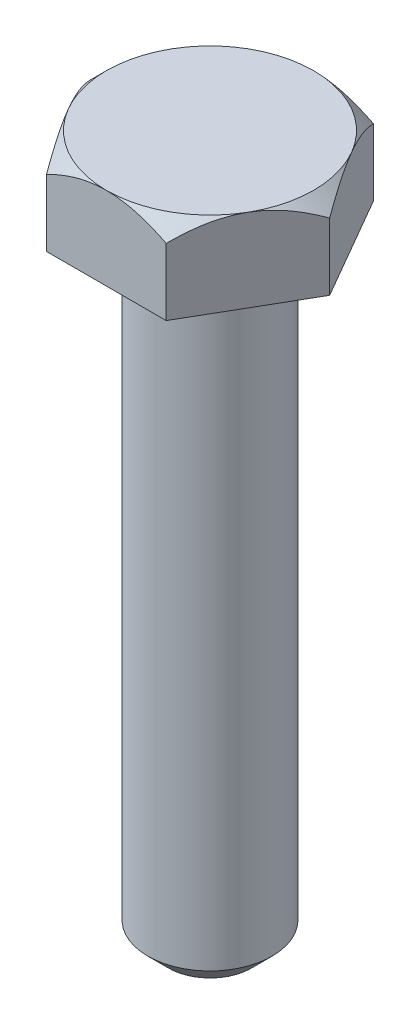
ISO-10303-21;
HEADER;
FILE_DESCRIPTION(('STEP AP214'),'2;1');
FILE_NAME('part.step','',(''),(''),'','','');
FILE_SCHEMA(('AUTOMOTIVE_DESIGN { 1 0 10303 214 1 1 1 1 }'));
ENDSEC;
DATA;
#1=APPLICATION_CONTEXT('core data for automotive mechanical design processes');
#2=APPLICATION_PROTOCOL_DEFINITION('international standard','automotive_design',2000,#1);
#3=PRODUCT_CONTEXT('',#1,'mechanical');
#4=PRODUCT('Part','Part','',(#3));
#5=PRODUCT_RELATED_PRODUCT_CATEGORY('part','',(#4));
#6=PRODUCT_DEFINITION_FORMATION('','',#4);
#7=PRODUCT_DEFINITION_CONTEXT('part definition',#1,'design');
#8=PRODUCT_DEFINITION('design','',#6,#7);
#9=PRODUCT_DEFINITION_SHAPE('','',#8);
#10=(LENGTH_UNIT() NAMED_UNIT(*) SI_UNIT(.MILLI.,.METRE.));
#11=(NAMED_UNIT(*) PLANE_ANGLE_UNIT() SI_UNIT($,.RADIAN.));
#12=(NAMED_UNIT(*) SI_UNIT($,.STERADIAN.) SOLID_ANGLE_UNIT());
#13=UNCERTAINTY_MEASURE_WITH_UNIT(LENGTH_MEASURE(1.E-05),#10,'distance_accuracy_value','');
#14=(GEOMETRIC_REPRESENTATION_CONTEXT(3) GLOBAL_UNCERTAINTY_ASSIGNED_CONTEXT((#13)) GLOBAL_UNIT_ASSIGNED_CONTEXT((#10,
#11,#12)) REPRESENTATION_CONTEXT('',''));
#15=CARTESIAN_POINT('',(0.,0.,0.));
#16=DIRECTION('',(0.,0.,1.));
#17=DIRECTION('',(1.,0.,0.));
#18=AXIS2_PLACEMENT_3D('',#15,#16,#17);
#19=CARTESIAN_POINT('',(2.88675134594813,4.,5.));
#20=DIRECTION('',(-0.866025403784439,0.,-0.5));
#21=DIRECTION('',(-0.5,0.,0.866025403784439));
#22=AXIS2_PLACEMENT_3D('',#19,#20,#21);
#23=PLANE('',#22);
#24=CARTESIAN_POINT('',(2.8866358758943,3.22638183458587,5.0002));
#25=CARTESIAN_POINT('',(2.93627227674213,3.27601376249948,4.91422723182669));
#26=CARTESIAN_POINT('',(2.98629020977269,3.32412258281684,4.82759363052819));
#27=CARTESIAN_POINT('',(3.08716399407135,3.41683067677396,4.65287511097116));
#28=CARTESIAN_POINT('',(3.13802028490869,3.46142803360226,4.56478943135639));
#29=CARTESIAN_POINT('',(3.29243146040539,3.58963823597549,4.29734143013967));
#30=CARTESIAN_POINT('',(3.39729352840467,3.66712224260222,4.11571500057817));
#31=CARTESIAN_POINT('',(3.60875628789733,3.79980836367822,3.74945075722818));
#32=CARTESIAN_POINT('',(3.71530292847296,3.8553447674579,3.56490656237539));
#33=CARTESIAN_POINT('',(3.87687459445692,3.91958681405622,3.28505622782763));
#34=CARTESIAN_POINT('',(3.9309696979787,3.9378151447651,3.19136076008721));
#35=CARTESIAN_POINT('',(4.03961794604879,3.96750512097762,3.00317647427647));
#36=CARTESIAN_POINT('',(4.09417102090353,3.97896777779865,2.90868777691895));
#37=CARTESIAN_POINT('',(4.22710825098566,3.99818644635776,2.67843374019923));
#38=CARTESIAN_POINT('',(4.30563563855841,4.00221901984403,2.54242031513758));
#39=CARTESIAN_POINT('',(4.46254889182113,3.99545145399843,2.27063858810561));
#40=CARTESIAN_POINT('',(4.5409346982583,3.98464611513274,2.13487038876419));
#41=CARTESIAN_POINT('',(4.69696731557988,3.9488396582057,1.86461396792525));
#42=CARTESIAN_POINT('',(4.77461320108935,3.92382266414548,1.73012734922417));
#43=CARTESIAN_POINT('',(4.92857043343805,3.86095298311431,1.46346560060355));
#44=CARTESIAN_POINT('',(5.00488188213304,3.82310128033618,1.33129029426464));
#45=CARTESIAN_POINT('',(5.14035048372463,3.7452274213432,1.0966517934777));
#46=CARTESIAN_POINT('',(5.19980756415579,3.70725305768472,0.993669109301214));
#47=CARTESIAN_POINT('',(5.31765436322277,3.62518468192979,0.789552465807838));
#48=CARTESIAN_POINT('',(5.37604404938545,3.58109048400019,0.688418562736089));
#49=CARTESIAN_POINT('',(5.49157215635531,3.48777092275138,0.488318011762032));
#50=CARTESIAN_POINT('',(5.54871386288991,3.43856169539435,0.389345672812916));
#51=CARTESIAN_POINT('',(5.66193913120707,3.33565818526073,0.193233755386963));
#52=CARTESIAN_POINT('',(5.7180233165161,3.28196665355472,0.0960930969306232));
#53=CARTESIAN_POINT('',(5.7736181619501,3.22638183458587,-0.000199999999995801));
#54=B_SPLINE_CURVE_WITH_KNOTS('',3,(#24,#25,#26,#27,#28,#29,#30,#31,#32,#33,#34,#35,#36,#37,#38,
#39,#40,#41,#42,#43,#44,#45,#46,#47,#48,#49,#50,#51,#52,#53),.UNSPECIFIED.,.F.,.F.,(4,2,2,2,2,2,
2,2,2,2,2,2,2,2,4),(0.,0.332945616209566,0.666071736106988,1.33592065243333,1.9951326259748,
2.32409207808823,2.65300234563689,3.12358963991982,3.59434188052352,4.06562104077025,
4.53686407049609,4.91117956742315,5.28550643319668,5.65868635377114,6.03163889109471),.UNSPECIFIED.);
#55=CARTESIAN_POINT('',(2.88675134594814,3.22649730810374,5.));
#56=VERTEX_POINT('',#55);
#57=CARTESIAN_POINT('',(4.33012701892219,4.,2.5));
#58=VERTEX_POINT('',#57);
#59=EDGE_CURVE('E120',#56,#58,#54,.T.);
#60=ORIENTED_EDGE('',*,*,#59,.F.);
#61=DIRECTION('',(0.,-1.,0.));
#62=VECTOR('',#61,1.);
#63=CARTESIAN_POINT('',(2.88675134594813,4.,5.));
#64=LINE('',#63,#62);
#65=CARTESIAN_POINT('',(2.88675134594813,0.,5.));
#66=VERTEX_POINT('',#65);
#67=EDGE_CURVE('E66',#56,#66,#64,.T.);
#68=ORIENTED_EDGE('',*,*,#67,.T.);
#69=DIRECTION('',(0.5,0.,-0.866025403784439));
#70=VECTOR('',#69,1.);
#71=CARTESIAN_POINT('',(2.88675134594813,0.,5.));
#72=LINE('',#71,#70);
#73=CARTESIAN_POINT('',(5.77350269189626,0.,0.));
#74=VERTEX_POINT('',#73);
#75=EDGE_CURVE('E132',#66,#74,#72,.T.);
#76=ORIENTED_EDGE('',*,*,#75,.T.);
#77=DIRECTION('',(0.,-1.,0.));
#78=VECTOR('',#77,1.);
#79=CARTESIAN_POINT('',(5.77350269189626,4.,0.));
#80=LINE('',#79,#78);
#81=CARTESIAN_POINT('',(5.77350269189626,3.22649730810374,0.));
#82=VERTEX_POINT('',#81);
#83=EDGE_CURVE('E157',#82,#74,#80,.T.);
#84=ORIENTED_EDGE('',*,*,#83,.F.);
#85=EDGE_CURVE('E130',#58,#82,#54,.T.);
#86=ORIENTED_EDGE('',*,*,#85,.F.);
#87=EDGE_LOOP('',(#60,#68,#76,#84,#86));
#88=FACE_BOUND('',#87,.T.);
#89=ADVANCED_FACE('F41',(#88),#23,.F.);
#90=CARTESIAN_POINT('',(5.77350269189626,4.,0.));
#91=DIRECTION('',(-0.866025403784439,0.,0.5));
#92=DIRECTION('',(0.5,0.,0.866025403784439));
#93=AXIS2_PLACEMENT_3D('',#90,#91,#92);
#94=PLANE('',#93);
#95=CARTESIAN_POINT('',(5.7736181619501,3.22638183458587,0.00020000000000377));
#96=CARTESIAN_POINT('',(5.72398176110226,3.27601376249948,-0.0857727681733029));
#97=CARTESIAN_POINT('',(5.6739638280717,3.32412258281684,-0.172406369471805));
#98=CARTESIAN_POINT('',(5.57309004377304,3.41683067677396,-0.347124889028835));
#99=CARTESIAN_POINT('',(5.5222337529357,3.46142803360226,-0.435210568643605));
#100=CARTESIAN_POINT('',(5.367822577439,3.58963823597549,-0.702658569860325));
#101=CARTESIAN_POINT('',(5.26296050943972,3.66712224260222,-0.884284999421824));
#102=CARTESIAN_POINT('',(5.05149774994706,3.79980836367823,-1.25054924277182));
#103=CARTESIAN_POINT('',(4.94495110937143,3.85534476745791,-1.4350934376246));
#104=CARTESIAN_POINT('',(4.78337944338747,3.91958681405623,-1.71494377217237));
#105=CARTESIAN_POINT('',(4.72928433986568,3.93781514476511,-1.80863923991279));
#106=CARTESIAN_POINT('',(4.6206360917956,3.96750512097762,-1.99682352572353));
#107=CARTESIAN_POINT('',(4.56608301694086,3.97896777779866,-2.09131222308105));
#108=CARTESIAN_POINT('',(4.43314578685873,3.99818644635776,-2.32156625980077));
#109=CARTESIAN_POINT('',(4.35461839928598,4.00221901984403,-2.45757968486242));
#110=CARTESIAN_POINT('',(4.19770514602325,3.99545145399843,-2.72936141189439));
#111=CARTESIAN_POINT('',(4.11931933958609,3.98464611513275,-2.86512961123582));
#112=CARTESIAN_POINT('',(3.96328672226451,3.94883965820571,-3.13538603207475));
#113=CARTESIAN_POINT('',(3.88564083675503,3.92382266414548,-3.26987265077583));
#114=CARTESIAN_POINT('',(3.73168360440634,3.86095298311431,-3.53653439939645));
#115=CARTESIAN_POINT('',(3.65537215571135,3.82310128033618,-3.66870970573536));
#116=CARTESIAN_POINT('',(3.51990355411976,3.74522742134321,-3.9033482065223));
#117=CARTESIAN_POINT('',(3.4604464736886,3.70725305768473,-4.00633089069879));
#118=CARTESIAN_POINT('',(3.34259967462161,3.6251846819298,-4.21044753419217));
#119=CARTESIAN_POINT('',(3.28420998845894,3.58109048400019,-4.31158143726392));
#120=CARTESIAN_POINT('',(3.16868188148908,3.48777092275138,-4.51168198823797));
#121=CARTESIAN_POINT('',(3.11154017495448,3.43856169539435,-4.61065432718709));
#122=CARTESIAN_POINT('',(2.99831490663731,3.33565818526074,-4.80676624461304));
#123=CARTESIAN_POINT('',(2.94223072132828,3.28196665355472,-4.90390690306938));
#124=CARTESIAN_POINT('',(2.88663587589429,3.22638183458587,-5.0002));
#125=B_SPLINE_CURVE_WITH_KNOTS('',3,(#95,#96,#97,#98,#99,#100,#101,#102,#103,#104,#105,#106,
#107,#108,#109,#110,#111,#112,#113,#114,#115,#116,#117,#118,#119,#120,#121,#122,#123,#124),
.UNSPECIFIED.,.F.,.F.,(4,2,2,2,2,2,2,2,2,2,2,2,2,2,4),(0.,0.332945616209568,0.66607173610699,
1.33592065243334,1.99513262597481,2.32409207808824,2.65300234563691,3.12358963991983,
3.59434188052353,4.06562104077026,4.5368640704961,4.91117956742316,5.2855064331967,
5.65868635377115,6.03163889109473),.UNSPECIFIED.);
#126=CARTESIAN_POINT('',(4.33012701892219,4.,-2.5));
#127=VERTEX_POINT('',#126);
#128=EDGE_CURVE('E248',#82,#127,#125,.T.);
#129=ORIENTED_EDGE('',*,*,#128,.F.);
#130=ORIENTED_EDGE('',*,*,#83,.T.);
#131=DIRECTION('',(-0.5,0.,-0.866025403784439));
#132=VECTOR('',#131,1.);
#133=CARTESIAN_POINT('',(5.77350269189626,0.,0.));
#134=LINE('',#133,#132);
#135=CARTESIAN_POINT('',(2.88675134594813,0.,-5.));
#136=VERTEX_POINT('',#135);
#137=EDGE_CURVE('E283',#74,#136,#134,.T.);
#138=ORIENTED_EDGE('',*,*,#137,.T.);
#139=DIRECTION('',(0.,-1.,0.));
#140=VECTOR('',#139,1.);
#141=CARTESIAN_POINT('',(2.88675134594813,4.,-5.));
#142=LINE('',#141,#140);
#143=CARTESIAN_POINT('',(2.88675134594813,3.22649730810374,-5.));
#144=VERTEX_POINT('',#143);
#145=EDGE_CURVE('E154',#144,#136,#142,.T.);
#146=ORIENTED_EDGE('',*,*,#145,.F.);
#147=EDGE_CURVE('E241',#127,#144,#125,.T.);
#148=ORIENTED_EDGE('',*,*,#147,.F.);
#149=EDGE_LOOP('',(#129,#130,#138,#146,#148));
#150=FACE_BOUND('',#149,.T.);
#151=ADVANCED_FACE('F256',(#150),#94,.F.);
#152=CARTESIAN_POINT('',(2.88675134594813,4.,-5.));
#153=DIRECTION('',(0.,0.,1.));
#154=DIRECTION('',(1.,0.,0.));
#155=AXIS2_PLACEMENT_3D('',#152,#153,#154);
#156=PLANE('',#155);
#157=CARTESIAN_POINT('',(8.71203844810412,-1.0448799854077,-5.));
#158=CARTESIAN_POINT('',(8.5831978741521,-0.93313792717727,-5.));
#159=CARTESIAN_POINT('',(8.45405651544667,-0.821742943395804,-5.));
#160=CARTESIAN_POINT('',(8.19509219088726,-0.599743936989518,-5.));
#161=CARTESIAN_POINT('',(8.06526921378456,-0.489139927489721,-5.));
#162=CARTESIAN_POINT('',(7.67454367206325,-0.158563139428221,-5.));
#163=CARTESIAN_POINT('',(7.41250362882974,0.0600707685256996,-5.));
#164=CARTESIAN_POINT('',(6.8785150649844,0.497647195894142,-5.));
#165=CARTESIAN_POINT('',(6.60647729709085,0.716481026633396,-5.));
#166=CARTESIAN_POINT('',(6.05727019423747,1.14751883309205,-5.));
#167=CARTESIAN_POINT('',(5.78010216273556,1.35972445700923,-5.));
#168=CARTESIAN_POINT('',(5.35903498889496,1.67126244138824,-5.));
#169=CARTESIAN_POINT('',(5.21769204689503,1.7740499872008,-5.));
#170=CARTESIAN_POINT('',(4.93302653953288,1.97684169605819,-5.));
#171=CARTESIAN_POINT('',(4.78970405556497,2.076845973038,-5.));
#172=CARTESIAN_POINT('',(4.50063854975329,2.27359485164281,-5.));
#173=CARTESIAN_POINT('',(4.35489341234613,2.37033635378657,-5.));
#174=CARTESIAN_POINT('',(4.0607719438188,2.55972013498106,-5.));
#175=CARTESIAN_POINT('',(3.91239584570391,2.6523627745237,-5.));
#176=CARTESIAN_POINT('',(3.61374969231941,2.8319324566285,-5.));
#177=CARTESIAN_POINT('',(3.46350271979835,2.91889770947456,-5.));
#178=CARTESIAN_POINT('',(3.15958835973702,3.08671462604809,-5.));
#179=CARTESIAN_POINT('',(3.00592056306173,3.16756555335406,-5.));
#180=CARTESIAN_POINT('',(2.69501633115613,3.32154041415361,-5.));
#181=CARTESIAN_POINT('',(2.53778554813639,3.39467566980827,-5.));
#182=CARTESIAN_POINT('',(2.21929484066451,3.53148968195511,-5.));
#183=CARTESIAN_POINT('',(2.05803651083188,3.59517211386286,-5.));
#184=CARTESIAN_POINT('',(1.72758279066673,3.71226495899688,-5.));
#185=CARTESIAN_POINT('',(1.55829012588765,3.76540471087648,-5.));
#186=CARTESIAN_POINT('',(1.21573185900666,3.85696560035552,-5.));
#187=CARTESIAN_POINT('',(1.04246689572976,3.89538908726926,-5.));
#188=CARTESIAN_POINT('',(0.694034742580099,3.95495888209458,-5.));
#189=CARTESIAN_POINT('',(0.518885902452946,3.97621039815157,-5.));
#190=CARTESIAN_POINT('',(0.167315900317895,4.00027360654048,-5.));
#191=CARTESIAN_POINT('',(-0.00910512613312215,4.00308723527118,-5.));
#192=CARTESIAN_POINT('',(-0.361470791874509,3.99004879904755,-5.));
#193=CARTESIAN_POINT('',(-0.537414510573158,3.97417240133445,-5.));
#194=CARTESIAN_POINT('',(-0.886816067769669,3.92491512881242,-5.));
#195=CARTESIAN_POINT('',(-1.06027340986983,3.89153080725736,-5.));
#196=CARTESIAN_POINT('',(-1.40467627285962,3.80915003983924,-5.));
#197=CARTESIAN_POINT('',(-1.57559522964511,3.76004447282702,-5.));
#198=CARTESIAN_POINT('',(-1.9130990626566,3.6488749470821,-5.));
#199=CARTESIAN_POINT('',(-2.07968389097797,3.58681084518855,-5.));
#200=CARTESIAN_POINT('',(-2.44558763174309,3.43699109431813,-5.));
#201=CARTESIAN_POINT('',(-2.64381748676758,3.34659796102011,-5.));
#202=CARTESIAN_POINT('',(-3.03437448719037,3.15375578042694,-5.));
#203=CARTESIAN_POINT('',(-3.22669814047419,3.05129976748847,-5.));
#204=CARTESIAN_POINT('',(-3.60653105970289,2.83701078660757,-5.));
#205=CARTESIAN_POINT('',(-3.79402952678572,2.72515883303368,-5.));
#206=CARTESIAN_POINT('',(-4.16456339874661,2.49441858608751,-5.));
#207=CARTESIAN_POINT('',(-4.3475996807593,2.37553169158465,-5.));
#208=CARTESIAN_POINT('',(-4.71093247306656,2.13161818799852,-5.));
#209=CARTESIAN_POINT('',(-4.89120920724706,2.00656225945493,-5.));
#210=CARTESIAN_POINT('',(-5.24864152249413,1.75206937857478,-5.));
#211=CARTESIAN_POINT('',(-5.42579699008165,1.62263226745045,-5.));
#212=CARTESIAN_POINT('',(-5.77728285746567,1.36041071680439,-5.));
#213=CARTESIAN_POINT('',(-5.95161632327831,1.22763037568208,-5.));
#214=CARTESIAN_POINT('',(-6.29808978144523,0.959232691631774,-5.));
#215=CARTESIAN_POINT('',(-6.47022970268278,0.823615257097249,-5.));
#216=CARTESIAN_POINT('',(-6.8181516788628,0.545658094344069,-5.));
#217=CARTESIAN_POINT('',(-6.99387295286573,0.40324240758789,-5.));
#218=CARTESIAN_POINT('',(-7.3436367539532,0.11636330071872,-5.));
#219=CARTESIAN_POINT('',(-7.51767926285807,-0.0281001415280631,-5.));
#220=CARTESIAN_POINT('',(-7.86247148388015,-0.317172718401494,-5.));
#221=CARTESIAN_POINT('',(-8.03323648730164,-0.461763639767527,-5.));
#222=CARTESIAN_POINT('',(-8.37351745799407,-0.752334699409602,-5.));
#223=CARTESIAN_POINT('',(-8.54303368620433,-0.898314531962043,-5.));
#224=CARTESIAN_POINT('',(-8.71203844810412,-1.04487998540771,-5.));
#225=B_SPLINE_CURVE_WITH_KNOTS('',3,(#157,#158,#159,#160,#161,#162,#163,#164,#165,#166,#167,
#168,#169,#170,#171,#172,#173,#174,#175,#176,#177,#178,#179,#180,#181,#182,#183,#184,#185,#186,
#187,#188,#189,#190,#191,#192,#193,#194,#195,#196,#197,#198,#199,#200,#201,#202,#203,#204,#205,
#206,#207,#208,#209,#210,#211,#212,#213,#214,#215,#216,#217,#218,#219,#220,#221,#222,#223,#224),
.UNSPECIFIED.,.F.,.F.,(4,2,2,2,2,2,2,2,2,2,2,2,2,2,2,2,2,2,2,2,2,2,2,2,2,2,2,2,2,2,2,2,2,4),(0.,
0.511638750629406,1.02328597152396,2.04705407161911,3.09438242340003,4.1414482345487,
4.66571969960353,5.18996967159441,5.71470437930035,6.23939284486737,6.76007871237078,
7.28082719276451,7.80080056222925,8.32057122479453,8.852324831665,9.38399351361807,
9.91237956303672,10.4407101189773,10.9697292758873,11.498852618743,12.0317312682685,
12.5646158051416,13.2176622003874,13.871087560432,14.5258665582163,15.1805157905502,
15.838650572321,16.4968092325517,17.1541969747328,17.8116059760822,18.490146058955,
19.1686934816376,19.8399564358517,20.5110749028444),.UNSPECIFIED.);
#226=CARTESIAN_POINT('',(0.,4.,-5.));
#227=VERTEX_POINT('',#226);
#228=EDGE_CURVE('E249',#144,#227,#225,.T.);
#229=ORIENTED_EDGE('',*,*,#228,.F.);
#230=ORIENTED_EDGE('',*,*,#145,.T.);
#231=DIRECTION('',(-1.,0.,0.));
#232=VECTOR('',#231,1.);
#233=CARTESIAN_POINT('',(2.88675134594813,0.,-5.));
#234=LINE('',#233,#232);
#235=CARTESIAN_POINT('',(-2.88675134594813,0.,-5.));
#236=VERTEX_POINT('',#235);
#237=EDGE_CURVE('E286',#136,#236,#234,.T.);
#238=ORIENTED_EDGE('',*,*,#237,.T.);
#239=DIRECTION('',(0.,-1.,0.));
#240=VECTOR('',#239,1.);
#241=CARTESIAN_POINT('',(-2.88675134594813,4.,-5.));
#242=LINE('',#241,#240);
#243=CARTESIAN_POINT('',(-2.88675134594813,3.22649730810374,-5.));
#244=VERTEX_POINT('',#243);
#245=EDGE_CURVE('E151',#244,#236,#242,.T.);
#246=ORIENTED_EDGE('',*,*,#245,.F.);
#247=EDGE_CURVE('E234',#227,#244,#225,.T.);
#248=ORIENTED_EDGE('',*,*,#247,.F.);
#249=EDGE_LOOP('',(#229,#230,#238,#246,#248));
#250=FACE_BOUND('',#249,.T.);
#251=ADVANCED_FACE('F259',(#250),#156,.F.);
#252=CARTESIAN_POINT('',(-2.88675134594813,4.,-5.));
#253=DIRECTION('',(0.866025403784439,0.,0.5));
#254=DIRECTION('',(0.5,0.,-0.866025403784439));
#255=AXIS2_PLACEMENT_3D('',#252,#253,#254);
#256=PLANE('',#255);
#257=CARTESIAN_POINT('',(-2.88663587589429,3.22638183458587,-5.0002));
#258=CARTESIAN_POINT('',(-2.93627227674213,3.27601376249948,-4.91422723182669));
#259=CARTESIAN_POINT('',(-2.98629020977268,3.32412258281684,-4.82759363052819));
#260=CARTESIAN_POINT('',(-3.08716399407135,3.41683067677396,-4.65287511097116));
#261=CARTESIAN_POINT('',(-3.13802028490869,3.46142803360226,-4.56478943135639));
#262=CARTESIAN_POINT('',(-3.29243146040539,3.58963823597549,-4.29734143013967));
#263=CARTESIAN_POINT('',(-3.39729352840467,3.66712224260222,-4.11571500057817));
#264=CARTESIAN_POINT('',(-3.60875628789732,3.79980836367822,-3.74945075722818));
#265=CARTESIAN_POINT('',(-3.71530292847296,3.85534476745791,-3.5649065623754));
#266=CARTESIAN_POINT('',(-3.87687459445692,3.91958681405622,-3.28505622782763));
#267=CARTESIAN_POINT('',(-3.9309696979787,3.9378151447651,-3.19136076008721));
#268=CARTESIAN_POINT('',(-4.03961794604878,3.96750512097762,-3.00317647427647));
#269=CARTESIAN_POINT('',(-4.09417102090353,3.97896777779866,-2.90868777691895));
#270=CARTESIAN_POINT('',(-4.22710825098566,3.99818644635776,-2.67843374019923));
#271=CARTESIAN_POINT('',(-4.3056356385584,4.00221901984403,-2.54242031513758));
#272=CARTESIAN_POINT('',(-4.46254889182113,3.99545145399843,-2.27063858810561));
#273=CARTESIAN_POINT('',(-4.54093469825829,3.98464611513274,-2.13487038876419));
#274=CARTESIAN_POINT('',(-4.69696731557988,3.9488396582057,-1.86461396792525));
#275=CARTESIAN_POINT('',(-4.77461320108935,3.92382266414548,-1.73012734922417));
#276=CARTESIAN_POINT('',(-4.92857043343804,3.86095298311431,-1.46346560060355));
#277=CARTESIAN_POINT('',(-5.00488188213303,3.82310128033618,-1.33129029426464));
#278=CARTESIAN_POINT('',(-5.14035048372462,3.74522742134321,-1.0966517934777));
#279=CARTESIAN_POINT('',(-5.19980756415579,3.70725305768472,-0.993669109301213));
#280=CARTESIAN_POINT('',(-5.31765436322277,3.6251846819298,-0.789552465807836));
#281=CARTESIAN_POINT('',(-5.37604404938544,3.58109048400019,-0.688418562736087));
#282=CARTESIAN_POINT('',(-5.49157215635531,3.48777092275138,-0.48831801176203));
#283=CARTESIAN_POINT('',(-5.54871386288991,3.43856169539435,-0.389345672812914));
#284=CARTESIAN_POINT('',(-5.66193913120707,3.33565818526074,-0.19323375538696));
#285=CARTESIAN_POINT('',(-5.7180233165161,3.28196665355472,-0.0960930969306205));
#286=CARTESIAN_POINT('',(-5.7736181619501,3.22638183458587,0.000199999999998444));
#287=B_SPLINE_CURVE_WITH_KNOTS('',3,(#257,#258,#259,#260,#261,#262,#263,#264,#265,#266,#267,
#268,#269,#270,#271,#272,#273,#274,#275,#276,#277,#278,#279,#280,#281,#282,#283,#284,#285,#286),
.UNSPECIFIED.,.F.,.F.,(4,2,2,2,2,2,2,2,2,2,2,2,2,2,4),(0.,0.332945616209567,0.666071736106989,
1.33592065243334,1.99513262597481,2.32409207808824,2.6530023456369,3.12358963991983,
3.59434188052353,4.06562104077026,4.5368640704961,4.91117956742316,5.28550643319669,
5.65868635377115,6.03163889109472),.UNSPECIFIED.);
#288=CARTESIAN_POINT('',(-4.33012701892219,4.,-2.5));
#289=VERTEX_POINT('',#288);
#290=EDGE_CURVE('E301',#244,#289,#287,.T.);
#291=ORIENTED_EDGE('',*,*,#290,.F.);
#292=ORIENTED_EDGE('',*,*,#245,.T.);
#293=DIRECTION('',(-0.5,0.,0.866025403784439));
#294=VECTOR('',#293,1.);
#295=CARTESIAN_POINT('',(-2.88675134594813,0.,-5.));
#296=LINE('',#295,#294);
#297=CARTESIAN_POINT('',(-5.77350269189626,0.,0.));
#298=VERTEX_POINT('',#297);
#299=EDGE_CURVE('E292',#236,#298,#296,.T.);
#300=ORIENTED_EDGE('',*,*,#299,.T.);
#301=DIRECTION('',(0.,-1.,0.));
#302=VECTOR('',#301,1.);
#303=CARTESIAN_POINT('',(-5.77350269189626,4.,0.));
#304=LINE('',#303,#302);
#305=CARTESIAN_POINT('',(-5.77350269189626,3.22649730810374,0.));
#306=VERTEX_POINT('',#305);
#307=EDGE_CURVE('E143',#306,#298,#304,.T.);
#308=ORIENTED_EDGE('',*,*,#307,.F.);
#309=EDGE_CURVE('E202',#289,#306,#287,.T.);
#310=ORIENTED_EDGE('',*,*,#309,.F.);
#311=EDGE_LOOP('',(#291,#292,#300,#308,#310));
#312=FACE_BOUND('',#311,.T.);
#313=ADVANCED_FACE('F299',(#312),#256,.F.);
#314=CARTESIAN_POINT('',(-5.77350269189626,4.,0.));
#315=DIRECTION('',(0.866025403784438,0.,-0.5));
#316=DIRECTION('',(-0.5,0.,-0.866025403784438));
#317=AXIS2_PLACEMENT_3D('',#314,#315,#316);
#318=PLANE('',#317);
#319=CARTESIAN_POINT('',(-5.7736181619501,3.22638183458587,-0.000200000000001775));
#320=CARTESIAN_POINT('',(-5.72398176110226,3.27601376249948,0.0857727681733054));
#321=CARTESIAN_POINT('',(-5.6739638280717,3.32412258281684,0.172406369471807));
#322=CARTESIAN_POINT('',(-5.57309004377304,3.41683067677396,0.347124889028837));
#323=CARTESIAN_POINT('',(-5.5222337529357,3.46142803360226,0.435210568643607));
#324=CARTESIAN_POINT('',(-5.367822577439,3.58963823597549,0.702658569860327));
#325=CARTESIAN_POINT('',(-5.26296050943972,3.66712224260222,0.884284999421825));
#326=CARTESIAN_POINT('',(-5.05149774994706,3.79980836367823,1.25054924277182));
#327=CARTESIAN_POINT('',(-4.94495110937143,3.85534476745791,1.4350934376246));
#328=CARTESIAN_POINT('',(-4.78337944338746,3.91958681405623,1.71494377217237));
#329=CARTESIAN_POINT('',(-4.72928433986568,3.93781514476511,1.80863923991279));
#330=CARTESIAN_POINT('',(-4.6206360917956,3.96750512097762,1.99682352572353));
#331=CARTESIAN_POINT('',(-4.56608301694086,3.97896777779866,2.09131222308105));
#332=CARTESIAN_POINT('',(-4.43314578685873,3.99818644635776,2.32156625980077));
#333=CARTESIAN_POINT('',(-4.35461839928598,4.00221901984403,2.45757968486242));
#334=CARTESIAN_POINT('',(-4.19770514602325,3.99545145399843,2.72936141189439));
#335=CARTESIAN_POINT('',(-4.11931933958609,3.98464611513275,2.86512961123581));
#336=CARTESIAN_POINT('',(-3.96328672226451,3.94883965820571,3.13538603207475));
#337=CARTESIAN_POINT('',(-3.88564083675503,3.92382266414548,3.26987265077583));
#338=CARTESIAN_POINT('',(-3.73168360440634,3.86095298311431,3.53653439939645));
#339=CARTESIAN_POINT('',(-3.65537215571135,3.82310128033618,3.66870970573536));
#340=CARTESIAN_POINT('',(-3.51990355411976,3.74522742134321,3.9033482065223));
#341=CARTESIAN_POINT('',(-3.4604464736886,3.70725305768473,4.00633089069879));
#342=CARTESIAN_POINT('',(-3.34259967462161,3.6251846819298,4.21044753419216));
#343=CARTESIAN_POINT('',(-3.28420998845894,3.58109048400019,4.31158143726391));
#344=CARTESIAN_POINT('',(-3.16868188148908,3.48777092275139,4.51168198823797));
#345=CARTESIAN_POINT('',(-3.11154017495448,3.43856169539436,4.61065432718708));
#346=CARTESIAN_POINT('',(-2.99831490663731,3.33565818526074,4.80676624461304));
#347=CARTESIAN_POINT('',(-2.94223072132828,3.28196665355473,4.90390690306938));
#348=CARTESIAN_POINT('',(-2.88663587589429,3.22638183458588,5.0002));
#349=B_SPLINE_CURVE_WITH_KNOTS('',3,(#319,#320,#321,#322,#323,#324,#325,#326,#327,#328,#329,
#330,#331,#332,#333,#334,#335,#336,#337,#338,#339,#340,#341,#342,#343,#344,#345,#346,#347,#348),
.UNSPECIFIED.,.F.,.F.,(4,2,2,2,2,2,2,2,2,2,2,2,2,2,4),(0.,0.332945616209568,0.66607173610699,
1.33592065243334,1.99513262597481,2.32409207808824,2.6530023456369,3.12358963991983,
3.59434188052353,4.06562104077026,4.5368640704961,4.91117956742316,5.28550643319669,
5.65868635377115,6.03163889109472),.UNSPECIFIED.);
#350=CARTESIAN_POINT('',(-4.33012701892219,4.,2.5));
#351=VERTEX_POINT('',#350);
#352=EDGE_CURVE('E194',#306,#351,#349,.T.);
#353=ORIENTED_EDGE('',*,*,#352,.F.);
#354=ORIENTED_EDGE('',*,*,#307,.T.);
#355=DIRECTION('',(0.5,0.,0.866025403784438));
#356=VECTOR('',#355,1.);
#357=CARTESIAN_POINT('',(-5.77350269189626,0.,0.));
#358=LINE('',#357,#356);
#359=CARTESIAN_POINT('',(-2.88675134594813,0.,5.));
#360=VERTEX_POINT('',#359);
#361=EDGE_CURVE('E145',#298,#360,#358,.T.);
#362=ORIENTED_EDGE('',*,*,#361,.T.);
#363=DIRECTION('',(0.,-1.,0.));
#364=VECTOR('',#363,1.);
#365=CARTESIAN_POINT('',(-2.88675134594813,4.,5.));
#366=LINE('',#365,#364);
#367=CARTESIAN_POINT('',(-2.88675134594814,3.22649730810374,5.));
#368=VERTEX_POINT('',#367);
#369=EDGE_CURVE('E139',#368,#360,#366,.T.);
#370=ORIENTED_EDGE('',*,*,#369,.F.);
#371=EDGE_CURVE('E192',#351,#368,#349,.T.);
#372=ORIENTED_EDGE('',*,*,#371,.F.);
#373=EDGE_LOOP('',(#353,#354,#362,#370,#372));
#374=FACE_BOUND('',#373,.T.);
#375=ADVANCED_FACE('F193',(#374),#318,.F.);
#376=CARTESIAN_POINT('',(-2.88675134594813,4.,5.));
#377=DIRECTION('',(0.,0.,-1.));
#378=DIRECTION('',(-1.,0.,0.));
#379=AXIS2_PLACEMENT_3D('',#376,#377,#378);
#380=PLANE('',#379);
#381=CARTESIAN_POINT('',(-8.71203844810412,-1.04487998540771,5.));
#382=CARTESIAN_POINT('',(-8.58319787415211,-0.933137927177273,5.));
#383=CARTESIAN_POINT('',(-8.45405651544667,-0.821742943395808,5.));
#384=CARTESIAN_POINT('',(-8.19509219088727,-0.599743936989521,5.));
#385=CARTESIAN_POINT('',(-8.06526921378457,-0.489139927489724,5.));
#386=CARTESIAN_POINT('',(-7.67454367206326,-0.158563139428222,5.));
#387=CARTESIAN_POINT('',(-7.41250362882974,0.060070768525699,5.));
#388=CARTESIAN_POINT('',(-6.87851506498441,0.497647195894142,5.));
#389=CARTESIAN_POINT('',(-6.60647729709085,0.716481026633396,5.));
#390=CARTESIAN_POINT('',(-6.05727019423747,1.14751883309205,5.));
#391=CARTESIAN_POINT('',(-5.78010216273556,1.35972445700923,5.));
#392=CARTESIAN_POINT('',(-5.35903498889496,1.67126244138824,5.));
#393=CARTESIAN_POINT('',(-5.21769204689503,1.7740499872008,5.));
#394=CARTESIAN_POINT('',(-4.93302653953288,1.97684169605819,5.));
#395=CARTESIAN_POINT('',(-4.78970405556497,2.076845973038,5.));
#396=CARTESIAN_POINT('',(-4.5006385497533,2.27359485164281,5.));
#397=CARTESIAN_POINT('',(-4.35489341234613,2.37033635378657,5.));
#398=CARTESIAN_POINT('',(-4.06077194381881,2.55972013498106,5.));
#399=CARTESIAN_POINT('',(-3.91239584570392,2.65236277452371,5.));
#400=CARTESIAN_POINT('',(-3.61374969231942,2.8319324566285,5.));
#401=CARTESIAN_POINT('',(-3.46350271979835,2.91889770947457,5.));
#402=CARTESIAN_POINT('',(-3.15958835973702,3.08671462604809,5.));
#403=CARTESIAN_POINT('',(-3.00592056306173,3.16756555335406,5.));
#404=CARTESIAN_POINT('',(-2.69501633115614,3.32154041415361,5.));
#405=CARTESIAN_POINT('',(-2.5377855481364,3.39467566980827,5.));
#406=CARTESIAN_POINT('',(-2.21929484066451,3.53148968195511,5.));
#407=CARTESIAN_POINT('',(-2.05803651083188,3.59517211386287,5.));
#408=CARTESIAN_POINT('',(-1.72758279066673,3.71226495899688,5.));
#409=CARTESIAN_POINT('',(-1.55829012588765,3.76540471087649,5.));
#410=CARTESIAN_POINT('',(-1.21573185900666,3.85696560035552,5.));
#411=CARTESIAN_POINT('',(-1.04246689572976,3.89538908726926,5.));
#412=CARTESIAN_POINT('',(-0.694034742580104,3.95495888209459,5.));
#413=CARTESIAN_POINT('',(-0.51888590245295,3.97621039815157,5.));
#414=CARTESIAN_POINT('',(-0.1673159003179,4.00027360654049,5.));
#415=CARTESIAN_POINT('',(0.00910512613311779,4.00308723527119,5.));
#416=CARTESIAN_POINT('',(0.361470791874504,3.99004879904756,5.));
#417=CARTESIAN_POINT('',(0.537414510573152,3.97417240133445,5.));
#418=CARTESIAN_POINT('',(0.886816067769663,3.92491512881243,5.));
#419=CARTESIAN_POINT('',(1.06027340986983,3.89153080725737,5.));
#420=CARTESIAN_POINT('',(1.40467627285961,3.80915003983925,5.));
#421=CARTESIAN_POINT('',(1.5755952296451,3.76004447282703,5.));
#422=CARTESIAN_POINT('',(1.9130990626566,3.64887494708211,5.));
#423=CARTESIAN_POINT('',(2.07968389097797,3.58681084518856,5.));
#424=CARTESIAN_POINT('',(2.44558763174309,3.43699109431814,5.));
#425=CARTESIAN_POINT('',(2.64381748676757,3.34659796102011,5.));
#426=CARTESIAN_POINT('',(3.03437448719036,3.15375578042695,5.));
#427=CARTESIAN_POINT('',(3.22669814047418,3.05129976748848,5.));
#428=CARTESIAN_POINT('',(3.60653105970287,2.83701078660758,5.));
#429=CARTESIAN_POINT('',(3.79402952678571,2.72515883303369,5.));
#430=CARTESIAN_POINT('',(4.1645633987466,2.49441858608752,5.));
#431=CARTESIAN_POINT('',(4.34759968075929,2.37553169158466,5.));
#432=CARTESIAN_POINT('',(4.71093247306655,2.13161818799853,5.));
#433=CARTESIAN_POINT('',(4.89120920724704,2.00656225945494,5.));
#434=CARTESIAN_POINT('',(5.24864152249411,1.7520693785748,5.));
#435=CARTESIAN_POINT('',(5.42579699008163,1.62263226745047,5.));
#436=CARTESIAN_POINT('',(5.77728285746565,1.3604107168044,5.));
#437=CARTESIAN_POINT('',(5.95161632327829,1.22763037568209,5.));
#438=CARTESIAN_POINT('',(6.29808978144521,0.95923269163179,5.));
#439=CARTESIAN_POINT('',(6.47022970268276,0.823615257097266,5.));
#440=CARTESIAN_POINT('',(6.81815167886279,0.545658094344085,5.));
#441=CARTESIAN_POINT('',(6.99387295286572,0.403242407587904,5.));
#442=CARTESIAN_POINT('',(7.34363675395319,0.116363300718732,5.));
#443=CARTESIAN_POINT('',(7.51767926285807,-0.0281001415280537,5.));
#444=CARTESIAN_POINT('',(7.86247148388015,-0.31717271840149,5.));
#445=CARTESIAN_POINT('',(8.03323648730164,-0.461763639767526,5.));
#446=CARTESIAN_POINT('',(8.37351745799408,-0.752334699409608,5.));
#447=CARTESIAN_POINT('',(8.54303368620434,-0.898314531962051,5.));
#448=CARTESIAN_POINT('',(8.71203844810413,-1.04487998540771,5.));
#449=B_SPLINE_CURVE_WITH_KNOTS('',3,(#381,#382,#383,#384,#385,#386,#387,#388,#389,#390,#391,
#392,#393,#394,#395,#396,#397,#398,#399,#400,#401,#402,#403,#404,#405,#406,#407,#408,#409,#410,
#411,#412,#413,#414,#415,#416,#417,#418,#419,#420,#421,#422,#423,#424,#425,#426,#427,#428,#429,
#430,#431,#432,#433,#434,#435,#436,#437,#438,#439,#440,#441,#442,#443,#444,#445,#446,#447,#448),
.UNSPECIFIED.,.F.,.F.,(4,2,2,2,2,2,2,2,2,2,2,2,2,2,2,2,2,2,2,2,2,2,2,2,2,2,2,2,2,2,2,2,2,4),(0.,
0.511638750629407,1.02328597152396,2.04705407161911,3.09438242340003,4.14144823454871,
4.66571969960353,5.18996967159442,5.71470437930036,6.23939284486738,6.76007871237079,
7.28082719276452,7.80080056222926,8.32057122479454,8.852324831665,9.38399351361808,
9.91237956303673,10.4407101189773,10.9697292758873,11.498852618743,12.0317312682685,
12.5646158051416,13.2176622003874,13.871087560432,14.5258665582163,15.1805157905502,
15.8386505723209,16.4968092325517,17.1541969747328,17.8116059760821,18.490146058955,
19.1686934816377,19.8399564358517,20.5110749028445),.UNSPECIFIED.);
#450=CARTESIAN_POINT('',(0.,4.,5.));
#451=VERTEX_POINT('',#450);
#452=EDGE_CURVE('E126',#368,#451,#449,.T.);
#453=ORIENTED_EDGE('',*,*,#452,.F.);
#454=ORIENTED_EDGE('',*,*,#369,.T.);
#455=DIRECTION('',(1.,0.,0.));
#456=VECTOR('',#455,1.);
#457=CARTESIAN_POINT('',(-2.88675134594813,0.,5.));
#458=LINE('',#457,#456);
#459=EDGE_CURVE('E136',#360,#66,#458,.T.);
#460=ORIENTED_EDGE('',*,*,#459,.T.);
#461=ORIENTED_EDGE('',*,*,#67,.F.);
#462=EDGE_CURVE('E118',#451,#56,#449,.T.);
#463=ORIENTED_EDGE('',*,*,#462,.F.);
#464=EDGE_LOOP('',(#453,#454,#460,#461,#463));
#465=FACE_BOUND('',#464,.T.);
#466=ADVANCED_FACE('F134',(#465),#380,.F.);
#467=CARTESIAN_POINT('',(0.,-30.,0.));
#468=DIRECTION('',(0.,1.,0.));
#469=DIRECTION('',(0.,0.,1.));
#470=AXIS2_PLACEMENT_3D('',#467,#468,#469);
#471=CYLINDRICAL_SURFACE('',#470,3.);
#472=CARTESIAN_POINT('',(0.,-29.,0.));
#473=DIRECTION('',(0.,1.,0.));
#474=DIRECTION('',(0.,0.,1.));
#475=AXIS2_PLACEMENT_3D('',#472,#473,#474);
#476=CIRCLE('',#475,3.);
#477=CARTESIAN_POINT('',(0.,-29.,3.));
#478=VERTEX_POINT('',#477);
#479=EDGE_CURVE('E51',#478,#478,#476,.T.);
#480=ORIENTED_EDGE('',*,*,#479,.T.);
#481=EDGE_LOOP('',(#480));
#482=FACE_BOUND('',#481,.T.);
#483=CARTESIAN_POINT('',(0.,0.,0.));
#484=DIRECTION('',(0.,1.,0.));
#485=DIRECTION('',(0.,0.,1.));
#486=AXIS2_PLACEMENT_3D('',#483,#484,#485);
#487=CIRCLE('',#486,3.);
#488=CARTESIAN_POINT('',(0.,0.,3.));
#489=VERTEX_POINT('',#488);
#490=EDGE_CURVE('E160',#489,#489,#487,.T.);
#491=ORIENTED_EDGE('',*,*,#490,.F.);
#492=EDGE_LOOP('',(#491));
#493=FACE_BOUND('',#492,.T.);
#494=ADVANCED_FACE('F268',(#482,#493),#471,.T.);
#495=CARTESIAN_POINT('',(0.,-30.,0.));
#496=DIRECTION('',(0.,1.,0.));
#497=DIRECTION('',(0.,0.,1.));
#498=AXIS2_PLACEMENT_3D('',#495,#496,#497);
#499=PLANE('',#498);
#500=CARTESIAN_POINT('',(0.,-30.,0.));
#501=DIRECTION('',(0.,1.,0.));
#502=DIRECTION('',(0.,0.,1.));
#503=AXIS2_PLACEMENT_3D('',#500,#501,#502);
#504=CIRCLE('',#503,1.99999999999999);
#505=CARTESIAN_POINT('',(0.,-30.,1.99999999999999));
#506=VERTEX_POINT('',#505);
#507=EDGE_CURVE('E11',#506,#506,#504,.F.);
#508=ORIENTED_EDGE('',*,*,#507,.T.);
#509=EDGE_LOOP('',(#508));
#510=FACE_BOUND('',#509,.T.);
#511=ADVANCED_FACE('F265',(#510),#499,.F.);
#512=CARTESIAN_POINT('',(0.,0.,0.));
#513=DIRECTION('',(0.,1.,0.));
#514=DIRECTION('',(0.,0.,1.));
#515=AXIS2_PLACEMENT_3D('',#512,#513,#514);
#516=PLANE('',#515);
#517=ORIENTED_EDGE('',*,*,#490,.T.);
#518=EDGE_LOOP('',(#517));
#519=FACE_BOUND('',#518,.T.);
#520=ORIENTED_EDGE('',*,*,#75,.F.);
#521=ORIENTED_EDGE('',*,*,#459,.F.);
#522=ORIENTED_EDGE('',*,*,#361,.F.);
#523=ORIENTED_EDGE('',*,*,#299,.F.);
#524=ORIENTED_EDGE('',*,*,#237,.F.);
#525=ORIENTED_EDGE('',*,*,#137,.F.);
#526=EDGE_LOOP('',(#520,#521,#522,#523,#524,#525));
#527=FACE_BOUND('',#526,.T.);
#528=ADVANCED_FACE('F267',(#519,#527),#516,.F.);
#529=CARTESIAN_POINT('',(0.,4.,0.));
#530=DIRECTION('',(0.,-1.,0.));
#531=DIRECTION('',(0.,0.,-1.));
#532=AXIS2_PLACEMENT_3D('',#529,#530,#531);
#533=CONICAL_SURFACE('',#532,5.,0.785398163397449);
#534=ORIENTED_EDGE('',*,*,#371,.T.);
#535=ORIENTED_EDGE('',*,*,#452,.T.);
#536=CARTESIAN_POINT('',(0.,4.,0.));
#537=DIRECTION('',(0.,1.,0.));
#538=DIRECTION('',(0.,0.,1.));
#539=AXIS2_PLACEMENT_3D('',#536,#537,#538);
#540=CIRCLE('',#539,5.);
#541=EDGE_CURVE('E58',#351,#451,#540,.T.);
#542=ORIENTED_EDGE('',*,*,#541,.F.);
#543=EDGE_LOOP('',(#534,#535,#542));
#544=FACE_BOUND('',#543,.T.);
#545=ADVANCED_FACE('F227',(#544),#533,.T.);
#546=ORIENTED_EDGE('',*,*,#309,.T.);
#547=ORIENTED_EDGE('',*,*,#352,.T.);
#548=EDGE_CURVE('E165',#289,#351,#540,.T.);
#549=ORIENTED_EDGE('',*,*,#548,.F.);
#550=EDGE_LOOP('',(#546,#547,#549));
#551=FACE_BOUND('',#550,.T.);
#552=ADVANCED_FACE('F320',(#551),#533,.T.);
#553=ORIENTED_EDGE('',*,*,#247,.T.);
#554=ORIENTED_EDGE('',*,*,#290,.T.);
#555=EDGE_CURVE('E177',#227,#289,#540,.T.);
#556=ORIENTED_EDGE('',*,*,#555,.F.);
#557=EDGE_LOOP('',(#553,#554,#556));
#558=FACE_BOUND('',#557,.T.);
#559=ADVANCED_FACE('F315',(#558),#533,.T.);
#560=ORIENTED_EDGE('',*,*,#147,.T.);
#561=ORIENTED_EDGE('',*,*,#228,.T.);
#562=EDGE_CURVE('E173',#127,#227,#540,.T.);
#563=ORIENTED_EDGE('',*,*,#562,.F.);
#564=EDGE_LOOP('',(#560,#561,#563));
#565=FACE_BOUND('',#564,.T.);
#566=ADVANCED_FACE('F311',(#565),#533,.T.);
#567=ORIENTED_EDGE('',*,*,#85,.T.);
#568=ORIENTED_EDGE('',*,*,#128,.T.);
#569=EDGE_CURVE('E166',#58,#127,#540,.T.);
#570=ORIENTED_EDGE('',*,*,#569,.F.);
#571=EDGE_LOOP('',(#567,#568,#570));
#572=FACE_BOUND('',#571,.T.);
#573=ADVANCED_FACE('F226',(#572),#533,.T.);
#574=ORIENTED_EDGE('',*,*,#59,.T.);
#575=CARTESIAN_POINT('',(0.,4.,0.));
#576=DIRECTION('',(0.,1.,0.));
#577=DIRECTION('',(0.,0.,1.));
#578=AXIS2_PLACEMENT_3D('',#575,#576,#577);
#579=CIRCLE('',#578,5.);
#580=EDGE_CURVE('E122',#451,#58,#579,.T.);
#581=ORIENTED_EDGE('',*,*,#580,.F.);
#582=ORIENTED_EDGE('',*,*,#462,.T.);
#583=EDGE_LOOP('',(#574,#581,#582));
#584=FACE_BOUND('',#583,.T.);
#585=ADVANCED_FACE('F119',(#584),#533,.T.);
#586=CARTESIAN_POINT('',(0.,4.,0.));
#587=DIRECTION('',(0.,1.,0.));
#588=DIRECTION('',(0.,0.,1.));
#589=AXIS2_PLACEMENT_3D('',#586,#587,#588);
#590=PLANE('',#589);
#591=ORIENTED_EDGE('',*,*,#541,.T.);
#592=ORIENTED_EDGE('',*,*,#580,.T.);
#593=ORIENTED_EDGE('',*,*,#569,.T.);
#594=ORIENTED_EDGE('',*,*,#562,.T.);
#595=ORIENTED_EDGE('',*,*,#555,.T.);
#596=ORIENTED_EDGE('',*,*,#548,.T.);
#597=EDGE_LOOP('',(#591,#592,#593,#594,#595,#596));
#598=FACE_BOUND('',#597,.T.);
#599=ADVANCED_FACE('F187',(#598),#590,.T.);
#600=CARTESIAN_POINT('',(0.,-29.,0.));
#601=DIRECTION('',(0.,1.,0.));
#602=DIRECTION('',(0.,0.,1.));
#603=AXIS2_PLACEMENT_3D('',#600,#601,#602);
#604=CONICAL_SURFACE('',#603,3.,0.785398163397452);
#605=ORIENTED_EDGE('',*,*,#507,.F.);
#606=EDGE_LOOP('',(#605));
#607=FACE_BOUND('',#606,.T.);
#608=ORIENTED_EDGE('',*,*,#479,.F.);
#609=EDGE_LOOP('',(#608));
#610=FACE_BOUND('',#609,.T.);
#611=ADVANCED_FACE('F44',(#607,#610),#604,.T.);
#612=CLOSED_SHELL('',(#89,#151,#251,#313,#375,#466,#494,#511,#528,#545,#552,#559,#566,#573,#585,
#599,#611));
#613=MANIFOLD_SOLID_BREP('B2',#612);
#614=ADVANCED_BREP_SHAPE_REPRESENTATION('',(#18,#613),#14);
#615=SHAPE_DEFINITION_REPRESENTATION(#9,#614);
ENDSEC;
END-ISO-10303-21;
